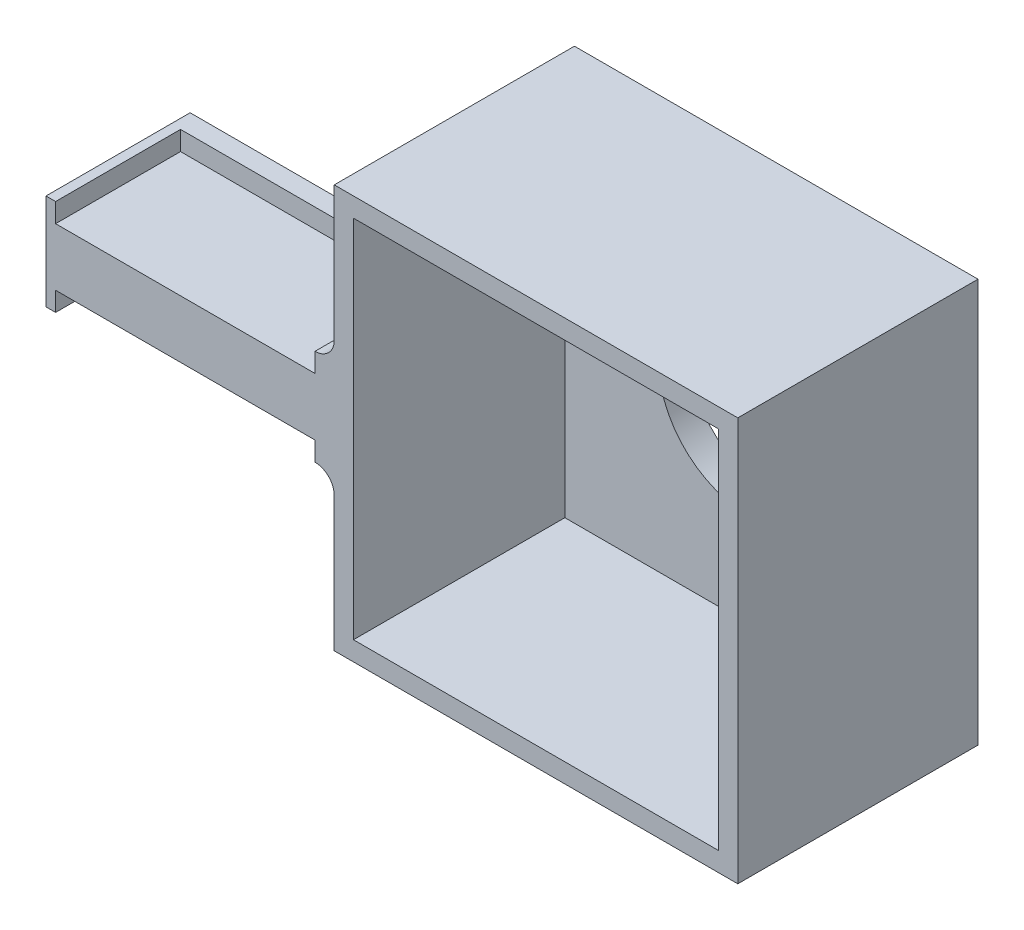
ISO-10303-21;
HEADER;
FILE_DESCRIPTION(('STEP AP214'),'2;1');
FILE_NAME('part.step','',(''),(''),'','','');
FILE_SCHEMA(('AUTOMOTIVE_DESIGN { 1 0 10303 214 1 1 1 1 }'));
ENDSEC;
DATA;
#1=APPLICATION_CONTEXT('core data for automotive mechanical design processes');
#2=APPLICATION_PROTOCOL_DEFINITION('international standard','automotive_design',2000,#1);
#3=PRODUCT_CONTEXT('',#1,'mechanical');
#4=PRODUCT('Part','Part','',(#3));
#5=PRODUCT_RELATED_PRODUCT_CATEGORY('part','',(#4));
#6=PRODUCT_DEFINITION_FORMATION('','',#4);
#7=PRODUCT_DEFINITION_CONTEXT('part definition',#1,'design');
#8=PRODUCT_DEFINITION('design','',#6,#7);
#9=PRODUCT_DEFINITION_SHAPE('','',#8);
#10=(LENGTH_UNIT() NAMED_UNIT(*) SI_UNIT(.MILLI.,.METRE.));
#11=(NAMED_UNIT(*) PLANE_ANGLE_UNIT() SI_UNIT($,.RADIAN.));
#12=(NAMED_UNIT(*) SI_UNIT($,.STERADIAN.) SOLID_ANGLE_UNIT());
#13=UNCERTAINTY_MEASURE_WITH_UNIT(LENGTH_MEASURE(1.E-05),#10,'distance_accuracy_value','');
#14=(GEOMETRIC_REPRESENTATION_CONTEXT(3) GLOBAL_UNCERTAINTY_ASSIGNED_CONTEXT((#13)) GLOBAL_UNIT_ASSIGNED_CONTEXT((#10,
#11,#12)) REPRESENTATION_CONTEXT('',''));
#15=CARTESIAN_POINT('',(0.,0.,0.));
#16=DIRECTION('',(0.,0.,1.));
#17=DIRECTION('',(1.,0.,0.));
#18=AXIS2_PLACEMENT_3D('',#15,#16,#17);
#19=CARTESIAN_POINT('',(0.,0.,25.));
#20=DIRECTION('',(1.,0.,0.));
#21=DIRECTION('',(0.,1.,0.));
#22=AXIS2_PLACEMENT_3D('',#19,#20,#21);
#23=PLANE('',#22);
#24=DIRECTION('',(0.,-1.,0.));
#25=VECTOR('',#24,1.);
#26=CARTESIAN_POINT('',(0.,0.,25.));
#27=LINE('',#26,#25);
#28=CARTESIAN_POINT('',(0.,-28.,25.));
#29=VERTEX_POINT('',#28);
#30=CARTESIAN_POINT('',(0.,-42.,25.));
#31=VERTEX_POINT('',#30);
#32=EDGE_CURVE('E310',#29,#31,#27,.T.);
#33=ORIENTED_EDGE('',*,*,#32,.F.);
#34=DIRECTION('',(0.,0.,1.));
#35=VECTOR('',#34,1.);
#36=CARTESIAN_POINT('',(0.,-28.,10.));
#37=LINE('',#36,#35);
#38=CARTESIAN_POINT('',(0.,-28.,10.));
#39=VERTEX_POINT('',#38);
#40=EDGE_CURVE('E343',#29,#39,#37,.F.);
#41=ORIENTED_EDGE('',*,*,#40,.T.);
#42=DIRECTION('',(0.,-1.,0.));
#43=VECTOR('',#42,1.);
#44=CARTESIAN_POINT('',(0.,-26.,10.));
#45=LINE('',#44,#43);
#46=CARTESIAN_POINT('',(0.,-14.,10.));
#47=VERTEX_POINT('',#46);
#48=EDGE_CURVE('E56',#47,#39,#45,.T.);
#49=ORIENTED_EDGE('',*,*,#48,.F.);
#50=DIRECTION('',(0.,0.,-1.));
#51=VECTOR('',#50,1.);
#52=CARTESIAN_POINT('',(0.,-14.,25.));
#53=LINE('',#52,#51);
#54=CARTESIAN_POINT('',(0.,-14.,25.));
#55=VERTEX_POINT('',#54);
#56=EDGE_CURVE('E341',#47,#55,#53,.F.);
#57=ORIENTED_EDGE('',*,*,#56,.T.);
#58=CARTESIAN_POINT('',(0.,0.,25.));
#59=VERTEX_POINT('',#58);
#60=EDGE_CURVE('E306',#59,#55,#27,.T.);
#61=ORIENTED_EDGE('',*,*,#60,.F.);
#62=DIRECTION('',(0.,0.,-1.));
#63=VECTOR('',#62,1.);
#64=CARTESIAN_POINT('',(0.,0.,25.));
#65=LINE('',#64,#63);
#66=CARTESIAN_POINT('',(0.,0.,0.));
#67=VERTEX_POINT('',#66);
#68=EDGE_CURVE('E316',#59,#67,#65,.T.);
#69=ORIENTED_EDGE('',*,*,#68,.T.);
#70=DIRECTION('',(0.,-1.,0.));
#71=VECTOR('',#70,1.);
#72=CARTESIAN_POINT('',(0.,0.,0.));
#73=LINE('',#72,#71);
#74=CARTESIAN_POINT('',(0.,-42.,0.));
#75=VERTEX_POINT('',#74);
#76=EDGE_CURVE('E299',#67,#75,#73,.T.);
#77=ORIENTED_EDGE('',*,*,#76,.T.);
#78=DIRECTION('',(0.,0.,-1.));
#79=VECTOR('',#78,1.);
#80=CARTESIAN_POINT('',(0.,-42.,25.));
#81=LINE('',#80,#79);
#82=EDGE_CURVE('E333',#31,#75,#81,.T.);
#83=ORIENTED_EDGE('',*,*,#82,.F.);
#84=EDGE_LOOP('',(#33,#41,#49,#57,#61,#69,#77,#83));
#85=FACE_BOUND('',#84,.T.);
#86=ADVANCED_FACE('F33',(#85),#23,.F.);
#87=CARTESIAN_POINT('',(0.,-42.,25.));
#88=DIRECTION('',(0.,1.,0.));
#89=DIRECTION('',(0.,0.,1.));
#90=AXIS2_PLACEMENT_3D('',#87,#88,#89);
#91=PLANE('',#90);
#92=DIRECTION('',(1.,0.,0.));
#93=VECTOR('',#92,1.);
#94=CARTESIAN_POINT('',(0.,-42.,0.));
#95=LINE('',#94,#93);
#96=CARTESIAN_POINT('',(42.,-42.,0.));
#97=VERTEX_POINT('',#96);
#98=EDGE_CURVE('E319',#75,#97,#95,.T.);
#99=ORIENTED_EDGE('',*,*,#98,.T.);
#100=DIRECTION('',(0.,0.,-1.));
#101=VECTOR('',#100,1.);
#102=CARTESIAN_POINT('',(42.,-42.,25.));
#103=LINE('',#102,#101);
#104=CARTESIAN_POINT('',(42.,-42.,25.));
#105=VERTEX_POINT('',#104);
#106=EDGE_CURVE('E330',#105,#97,#103,.T.);
#107=ORIENTED_EDGE('',*,*,#106,.F.);
#108=DIRECTION('',(1.,0.,0.));
#109=VECTOR('',#108,1.);
#110=CARTESIAN_POINT('',(0.,-42.,25.));
#111=LINE('',#110,#109);
#112=EDGE_CURVE('E309',#31,#105,#111,.T.);
#113=ORIENTED_EDGE('',*,*,#112,.F.);
#114=ORIENTED_EDGE('',*,*,#82,.T.);
#115=EDGE_LOOP('',(#99,#107,#113,#114));
#116=FACE_BOUND('',#115,.T.);
#117=ADVANCED_FACE('F374',(#116),#91,.F.);
#118=CARTESIAN_POINT('',(42.,0.,25.));
#119=DIRECTION('',(-1.,0.,0.));
#120=DIRECTION('',(0.,-1.,0.));
#121=AXIS2_PLACEMENT_3D('',#118,#119,#120);
#122=PLANE('',#121);
#123=DIRECTION('',(0.,1.,0.));
#124=VECTOR('',#123,1.);
#125=CARTESIAN_POINT('',(42.,0.,0.));
#126=LINE('',#125,#124);
#127=CARTESIAN_POINT('',(42.,0.,0.));
#128=VERTEX_POINT('',#127);
#129=EDGE_CURVE('E321',#97,#128,#126,.T.);
#130=ORIENTED_EDGE('',*,*,#129,.T.);
#131=DIRECTION('',(0.,0.,-1.));
#132=VECTOR('',#131,1.);
#133=CARTESIAN_POINT('',(42.,0.,25.));
#134=LINE('',#133,#132);
#135=CARTESIAN_POINT('',(42.,0.,25.));
#136=VERTEX_POINT('',#135);
#137=EDGE_CURVE('E327',#136,#128,#134,.T.);
#138=ORIENTED_EDGE('',*,*,#137,.F.);
#139=DIRECTION('',(0.,1.,0.));
#140=VECTOR('',#139,1.);
#141=CARTESIAN_POINT('',(42.,0.,25.));
#142=LINE('',#141,#140);
#143=EDGE_CURVE('E312',#105,#136,#142,.T.);
#144=ORIENTED_EDGE('',*,*,#143,.F.);
#145=ORIENTED_EDGE('',*,*,#106,.T.);
#146=EDGE_LOOP('',(#130,#138,#144,#145));
#147=FACE_BOUND('',#146,.T.);
#148=ADVANCED_FACE('F406',(#147),#122,.F.);
#149=CARTESIAN_POINT('',(0.,0.,25.));
#150=DIRECTION('',(0.,-1.,0.));
#151=DIRECTION('',(0.,0.,-1.));
#152=AXIS2_PLACEMENT_3D('',#149,#150,#151);
#153=PLANE('',#152);
#154=DIRECTION('',(-1.,0.,0.));
#155=VECTOR('',#154,1.);
#156=CARTESIAN_POINT('',(0.,0.,0.));
#157=LINE('',#156,#155);
#158=EDGE_CURVE('E323',#128,#67,#157,.T.);
#159=ORIENTED_EDGE('',*,*,#158,.T.);
#160=ORIENTED_EDGE('',*,*,#68,.F.);
#161=DIRECTION('',(-1.,0.,0.));
#162=VECTOR('',#161,1.);
#163=CARTESIAN_POINT('',(0.,0.,25.));
#164=LINE('',#163,#162);
#165=EDGE_CURVE('E314',#136,#59,#164,.T.);
#166=ORIENTED_EDGE('',*,*,#165,.F.);
#167=ORIENTED_EDGE('',*,*,#137,.T.);
#168=EDGE_LOOP('',(#159,#160,#166,#167));
#169=FACE_BOUND('',#168,.T.);
#170=ADVANCED_FACE('F364',(#169),#153,.F.);
#171=CARTESIAN_POINT('',(0.,0.,25.));
#172=DIRECTION('',(0.,0.,1.));
#173=DIRECTION('',(1.,0.,0.));
#174=AXIS2_PLACEMENT_3D('',#171,#172,#173);
#175=PLANE('',#174);
#176=DIRECTION('',(0.,1.,0.));
#177=VECTOR('',#176,1.);
#178=CARTESIAN_POINT('',(-29.,-18.,25.));
#179=LINE('',#178,#177);
#180=CARTESIAN_POINT('',(-29.,-18.,25.));
#181=VERTEX_POINT('',#180);
#182=CARTESIAN_POINT('',(-29.,-16.,25.));
#183=VERTEX_POINT('',#182);
#184=EDGE_CURVE('E176',#181,#183,#179,.T.);
#185=ORIENTED_EDGE('',*,*,#184,.T.);
#186=DIRECTION('',(1.,0.,0.));
#187=VECTOR('',#186,1.);
#188=CARTESIAN_POINT('',(-30.,-16.,25.));
#189=LINE('',#188,#187);
#190=CARTESIAN_POINT('',(-30.,-16.,25.));
#191=VERTEX_POINT('',#190);
#192=EDGE_CURVE('E261',#191,#183,#189,.T.);
#193=ORIENTED_EDGE('',*,*,#192,.F.);
#194=DIRECTION('',(0.,1.,0.));
#195=VECTOR('',#194,1.);
#196=CARTESIAN_POINT('',(-30.,-26.,25.));
#197=LINE('',#196,#195);
#198=CARTESIAN_POINT('',(-30.,-26.,25.));
#199=VERTEX_POINT('',#198);
#200=EDGE_CURVE('E254',#199,#191,#197,.T.);
#201=ORIENTED_EDGE('',*,*,#200,.F.);
#202=DIRECTION('',(1.,0.,0.));
#203=VECTOR('',#202,1.);
#204=CARTESIAN_POINT('',(-30.,-26.,25.));
#205=LINE('',#204,#203);
#206=CARTESIAN_POINT('',(-29.,-26.,25.));
#207=VERTEX_POINT('',#206);
#208=EDGE_CURVE('E263',#199,#207,#205,.T.);
#209=ORIENTED_EDGE('',*,*,#208,.T.);
#210=DIRECTION('',(0.,-1.,0.));
#211=VECTOR('',#210,1.);
#212=CARTESIAN_POINT('',(-29.,-24.,25.));
#213=LINE('',#212,#211);
#214=CARTESIAN_POINT('',(-29.,-24.,25.));
#215=VERTEX_POINT('',#214);
#216=EDGE_CURVE('E245',#215,#207,#213,.T.);
#217=ORIENTED_EDGE('',*,*,#216,.F.);
#218=DIRECTION('',(-1.,0.,0.));
#219=VECTOR('',#218,1.);
#220=CARTESIAN_POINT('',(-2.,-24.,25.));
#221=LINE('',#220,#219);
#222=CARTESIAN_POINT('',(-2.,-24.,25.));
#223=VERTEX_POINT('',#222);
#224=EDGE_CURVE('E223',#223,#215,#221,.T.);
#225=ORIENTED_EDGE('',*,*,#224,.F.);
#226=DIRECTION('',(0.,-1.,0.));
#227=VECTOR('',#226,1.);
#228=CARTESIAN_POINT('',(-2.,-24.,25.));
#229=LINE('',#228,#227);
#230=CARTESIAN_POINT('',(-2.,-26.,25.));
#231=VERTEX_POINT('',#230);
#232=EDGE_CURVE('E233',#223,#231,#229,.T.);
#233=ORIENTED_EDGE('',*,*,#232,.T.);
#234=CARTESIAN_POINT('',(-1.99999999999999,-28.,25.));
#235=DIRECTION('',(0.,0.,1.));
#236=DIRECTION('',(1.,0.,0.));
#237=AXIS2_PLACEMENT_3D('',#234,#235,#236);
#238=CIRCLE('',#237,2.);
#239=EDGE_CURVE('E346',#231,#29,#238,.F.);
#240=ORIENTED_EDGE('',*,*,#239,.T.);
#241=ORIENTED_EDGE('',*,*,#32,.T.);
#242=ORIENTED_EDGE('',*,*,#112,.T.);
#243=ORIENTED_EDGE('',*,*,#143,.T.);
#244=ORIENTED_EDGE('',*,*,#165,.T.);
#245=ORIENTED_EDGE('',*,*,#60,.T.);
#246=CARTESIAN_POINT('',(-1.99999999999999,-14.,25.));
#247=DIRECTION('',(0.,0.,1.));
#248=DIRECTION('',(1.,0.,0.));
#249=AXIS2_PLACEMENT_3D('',#246,#247,#248);
#250=CIRCLE('',#249,2.);
#251=CARTESIAN_POINT('',(-2.,-16.,25.));
#252=VERTEX_POINT('',#251);
#253=EDGE_CURVE('E11',#55,#252,#250,.F.);
#254=ORIENTED_EDGE('',*,*,#253,.T.);
#255=DIRECTION('',(0.,1.,0.));
#256=VECTOR('',#255,1.);
#257=CARTESIAN_POINT('',(-2.,-18.,25.));
#258=LINE('',#257,#256);
#259=CARTESIAN_POINT('',(-2.,-18.,25.));
#260=VERTEX_POINT('',#259);
#261=EDGE_CURVE('E187',#260,#252,#258,.T.);
#262=ORIENTED_EDGE('',*,*,#261,.F.);
#263=DIRECTION('',(1.,0.,0.));
#264=VECTOR('',#263,1.);
#265=CARTESIAN_POINT('',(-29.,-18.,25.));
#266=LINE('',#265,#264);
#267=EDGE_CURVE('E194',#181,#260,#266,.T.);
#268=ORIENTED_EDGE('',*,*,#267,.F.);
#269=EDGE_LOOP('',(#185,#193,#201,#209,#217,#225,#233,#240,#241,#242,#243,#244,#245,#254,#262,#268));
#270=FACE_BOUND('',#269,.T.);
#271=DIRECTION('',(0.,-1.,0.));
#272=VECTOR('',#271,1.);
#273=CARTESIAN_POINT('',(2.,-2.,25.));
#274=LINE('',#273,#272);
#275=CARTESIAN_POINT('',(2.,-2.,25.));
#276=VERTEX_POINT('',#275);
#277=CARTESIAN_POINT('',(2.,-40.,25.));
#278=VERTEX_POINT('',#277);
#279=EDGE_CURVE('E287',#276,#278,#274,.T.);
#280=ORIENTED_EDGE('',*,*,#279,.F.);
#281=DIRECTION('',(-1.,0.,0.));
#282=VECTOR('',#281,1.);
#283=CARTESIAN_POINT('',(2.,-2.,25.));
#284=LINE('',#283,#282);
#285=CARTESIAN_POINT('',(40.,-2.,25.));
#286=VERTEX_POINT('',#285);
#287=EDGE_CURVE('E277',#286,#276,#284,.T.);
#288=ORIENTED_EDGE('',*,*,#287,.F.);
#289=DIRECTION('',(0.,1.,0.));
#290=VECTOR('',#289,1.);
#291=CARTESIAN_POINT('',(40.,-2.,25.));
#292=LINE('',#291,#290);
#293=CARTESIAN_POINT('',(40.,-40.,25.));
#294=VERTEX_POINT('',#293);
#295=EDGE_CURVE('E292',#294,#286,#292,.T.);
#296=ORIENTED_EDGE('',*,*,#295,.F.);
#297=DIRECTION('',(1.,0.,0.));
#298=VECTOR('',#297,1.);
#299=CARTESIAN_POINT('',(2.,-40.,25.));
#300=LINE('',#299,#298);
#301=EDGE_CURVE('E289',#278,#294,#300,.T.);
#302=ORIENTED_EDGE('',*,*,#301,.F.);
#303=EDGE_LOOP('',(#280,#288,#296,#302));
#304=FACE_BOUND('',#303,.T.);
#305=ADVANCED_FACE('F199',(#270,#304),#175,.T.);
#306=CARTESIAN_POINT('',(0.,0.,0.));
#307=DIRECTION('',(0.,0.,1.));
#308=DIRECTION('',(1.,0.,0.));
#309=AXIS2_PLACEMENT_3D('',#306,#307,#308);
#310=PLANE('',#309);
#311=CARTESIAN_POINT('',(21.,-21.,0.));
#312=DIRECTION('',(0.,0.,-1.));
#313=DIRECTION('',(-1.,0.,0.));
#314=AXIS2_PLACEMENT_3D('',#311,#312,#313);
#315=CIRCLE('',#314,9.25);
#316=CARTESIAN_POINT('',(11.75,-21.,0.));
#317=VERTEX_POINT('',#316);
#318=EDGE_CURVE('E269',#317,#317,#315,.T.);
#319=ORIENTED_EDGE('',*,*,#318,.F.);
#320=EDGE_LOOP('',(#319));
#321=FACE_BOUND('',#320,.T.);
#322=ORIENTED_EDGE('',*,*,#76,.F.);
#323=ORIENTED_EDGE('',*,*,#158,.F.);
#324=ORIENTED_EDGE('',*,*,#129,.F.);
#325=ORIENTED_EDGE('',*,*,#98,.F.);
#326=EDGE_LOOP('',(#322,#323,#324,#325));
#327=FACE_BOUND('',#326,.T.);
#328=ADVANCED_FACE('F369',(#321,#327),#310,.F.);
#329=CARTESIAN_POINT('',(2.,-2.,3.));
#330=DIRECTION('',(-1.,0.,0.));
#331=DIRECTION('',(0.,-1.,0.));
#332=AXIS2_PLACEMENT_3D('',#329,#330,#331);
#333=PLANE('',#332);
#334=ORIENTED_EDGE('',*,*,#279,.T.);
#335=DIRECTION('',(0.,0.,1.));
#336=VECTOR('',#335,1.);
#337=CARTESIAN_POINT('',(2.,-40.,3.));
#338=LINE('',#337,#336);
#339=CARTESIAN_POINT('',(2.,-40.,3.));
#340=VERTEX_POINT('',#339);
#341=EDGE_CURVE('E286',#340,#278,#338,.T.);
#342=ORIENTED_EDGE('',*,*,#341,.F.);
#343=DIRECTION('',(0.,-1.,0.));
#344=VECTOR('',#343,1.);
#345=CARTESIAN_POINT('',(2.,-2.,3.));
#346=LINE('',#345,#344);
#347=CARTESIAN_POINT('',(2.,-2.,3.));
#348=VERTEX_POINT('',#347);
#349=EDGE_CURVE('E273',#348,#340,#346,.T.);
#350=ORIENTED_EDGE('',*,*,#349,.F.);
#351=DIRECTION('',(0.,0.,1.));
#352=VECTOR('',#351,1.);
#353=CARTESIAN_POINT('',(2.,-2.,3.));
#354=LINE('',#353,#352);
#355=EDGE_CURVE('E297',#348,#276,#354,.T.);
#356=ORIENTED_EDGE('',*,*,#355,.T.);
#357=EDGE_LOOP('',(#334,#342,#350,#356));
#358=FACE_BOUND('',#357,.T.);
#359=ADVANCED_FACE('F568',(#358),#333,.F.);
#360=CARTESIAN_POINT('',(2.,-2.,3.));
#361=DIRECTION('',(0.,1.,0.));
#362=DIRECTION('',(0.,0.,1.));
#363=AXIS2_PLACEMENT_3D('',#360,#361,#362);
#364=PLANE('',#363);
#365=ORIENTED_EDGE('',*,*,#287,.T.);
#366=ORIENTED_EDGE('',*,*,#355,.F.);
#367=DIRECTION('',(-1.,0.,0.));
#368=VECTOR('',#367,1.);
#369=CARTESIAN_POINT('',(2.,-2.,3.));
#370=LINE('',#369,#368);
#371=CARTESIAN_POINT('',(40.,-2.,3.));
#372=VERTEX_POINT('',#371);
#373=EDGE_CURVE('E283',#372,#348,#370,.T.);
#374=ORIENTED_EDGE('',*,*,#373,.F.);
#375=DIRECTION('',(0.,0.,1.));
#376=VECTOR('',#375,1.);
#377=CARTESIAN_POINT('',(40.,-2.,3.));
#378=LINE('',#377,#376);
#379=EDGE_CURVE('E300',#372,#286,#378,.T.);
#380=ORIENTED_EDGE('',*,*,#379,.T.);
#381=EDGE_LOOP('',(#365,#366,#374,#380));
#382=FACE_BOUND('',#381,.T.);
#383=ADVANCED_FACE('F588',(#382),#364,.F.);
#384=CARTESIAN_POINT('',(40.,-2.,3.));
#385=DIRECTION('',(1.,0.,0.));
#386=DIRECTION('',(0.,0.,-1.));
#387=AXIS2_PLACEMENT_3D('',#384,#385,#386);
#388=PLANE('',#387);
#389=ORIENTED_EDGE('',*,*,#295,.T.);
#390=ORIENTED_EDGE('',*,*,#379,.F.);
#391=DIRECTION('',(0.,1.,0.));
#392=VECTOR('',#391,1.);
#393=CARTESIAN_POINT('',(40.,-2.,3.));
#394=LINE('',#393,#392);
#395=CARTESIAN_POINT('',(40.,-40.,3.));
#396=VERTEX_POINT('',#395);
#397=EDGE_CURVE('E280',#396,#372,#394,.T.);
#398=ORIENTED_EDGE('',*,*,#397,.F.);
#399=DIRECTION('',(0.,0.,1.));
#400=VECTOR('',#399,1.);
#401=CARTESIAN_POINT('',(40.,-40.,3.));
#402=LINE('',#401,#400);
#403=EDGE_CURVE('E302',#396,#294,#402,.T.);
#404=ORIENTED_EDGE('',*,*,#403,.T.);
#405=EDGE_LOOP('',(#389,#390,#398,#404));
#406=FACE_BOUND('',#405,.T.);
#407=ADVANCED_FACE('F578',(#406),#388,.F.);
#408=CARTESIAN_POINT('',(2.,-40.,3.));
#409=DIRECTION('',(0.,-1.,0.));
#410=DIRECTION('',(0.,0.,-1.));
#411=AXIS2_PLACEMENT_3D('',#408,#409,#410);
#412=PLANE('',#411);
#413=ORIENTED_EDGE('',*,*,#301,.T.);
#414=ORIENTED_EDGE('',*,*,#403,.F.);
#415=DIRECTION('',(1.,0.,0.));
#416=VECTOR('',#415,1.);
#417=CARTESIAN_POINT('',(2.,-40.,3.));
#418=LINE('',#417,#416);
#419=EDGE_CURVE('E276',#340,#396,#418,.T.);
#420=ORIENTED_EDGE('',*,*,#419,.F.);
#421=ORIENTED_EDGE('',*,*,#341,.T.);
#422=EDGE_LOOP('',(#413,#414,#420,#421));
#423=FACE_BOUND('',#422,.T.);
#424=ADVANCED_FACE('F557',(#423),#412,.F.);
#425=CARTESIAN_POINT('',(0.,0.,3.));
#426=DIRECTION('',(0.,0.,1.));
#427=DIRECTION('',(1.,0.,0.));
#428=AXIS2_PLACEMENT_3D('',#425,#426,#427);
#429=PLANE('',#428);
#430=CARTESIAN_POINT('',(21.,-21.,3.));
#431=DIRECTION('',(0.,0.,1.));
#432=DIRECTION('',(1.,0.,0.));
#433=AXIS2_PLACEMENT_3D('',#430,#431,#432);
#434=CIRCLE('',#433,9.25);
#435=CARTESIAN_POINT('',(30.25,-21.,3.));
#436=VERTEX_POINT('',#435);
#437=EDGE_CURVE('E272',#436,#436,#434,.T.);
#438=ORIENTED_EDGE('',*,*,#437,.F.);
#439=EDGE_LOOP('',(#438));
#440=FACE_BOUND('',#439,.T.);
#441=ORIENTED_EDGE('',*,*,#349,.T.);
#442=ORIENTED_EDGE('',*,*,#419,.T.);
#443=ORIENTED_EDGE('',*,*,#397,.T.);
#444=ORIENTED_EDGE('',*,*,#373,.T.);
#445=EDGE_LOOP('',(#441,#442,#443,#444));
#446=FACE_BOUND('',#445,.T.);
#447=ADVANCED_FACE('F547',(#440,#446),#429,.T.);
#448=CARTESIAN_POINT('',(21.,-21.,25.));
#449=DIRECTION('',(0.,0.,-1.));
#450=DIRECTION('',(-1.,0.,0.));
#451=AXIS2_PLACEMENT_3D('',#448,#449,#450);
#452=CYLINDRICAL_SURFACE('',#451,9.25);
#453=ORIENTED_EDGE('',*,*,#437,.T.);
#454=EDGE_LOOP('',(#453));
#455=FACE_BOUND('',#454,.T.);
#456=ORIENTED_EDGE('',*,*,#318,.T.);
#457=EDGE_LOOP('',(#456));
#458=FACE_BOUND('',#457,.T.);
#459=ADVANCED_FACE('F513',(#455,#458),#452,.F.);
#460=CARTESIAN_POINT('',(-30.,-26.,10.));
#461=DIRECTION('',(0.,0.,1.));
#462=DIRECTION('',(1.,0.,0.));
#463=AXIS2_PLACEMENT_3D('',#460,#461,#462);
#464=PLANE('',#463);
#465=ORIENTED_EDGE('',*,*,#48,.T.);
#466=CARTESIAN_POINT('',(-1.99999999999999,-28.,10.));
#467=DIRECTION('',(0.,0.,1.));
#468=DIRECTION('',(1.,0.,0.));
#469=AXIS2_PLACEMENT_3D('',#466,#467,#468);
#470=CIRCLE('',#469,2.);
#471=CARTESIAN_POINT('',(-1.99999999999999,-26.,10.));
#472=VERTEX_POINT('',#471);
#473=EDGE_CURVE('E348',#39,#472,#470,.T.);
#474=ORIENTED_EDGE('',*,*,#473,.T.);
#475=DIRECTION('',(1.,0.,0.));
#476=VECTOR('',#475,1.);
#477=CARTESIAN_POINT('',(-30.,-26.,10.));
#478=LINE('',#477,#476);
#479=CARTESIAN_POINT('',(-30.,-26.,10.));
#480=VERTEX_POINT('',#479);
#481=EDGE_CURVE('E266',#480,#472,#478,.T.);
#482=ORIENTED_EDGE('',*,*,#481,.F.);
#483=DIRECTION('',(0.,-1.,0.));
#484=VECTOR('',#483,1.);
#485=CARTESIAN_POINT('',(-30.,-26.,10.));
#486=LINE('',#485,#484);
#487=CARTESIAN_POINT('',(-30.,-16.,10.));
#488=VERTEX_POINT('',#487);
#489=EDGE_CURVE('E249',#488,#480,#486,.T.);
#490=ORIENTED_EDGE('',*,*,#489,.F.);
#491=DIRECTION('',(1.,0.,0.));
#492=VECTOR('',#491,1.);
#493=CARTESIAN_POINT('',(-30.,-16.,10.));
#494=LINE('',#493,#492);
#495=CARTESIAN_POINT('',(-1.99999999999999,-16.,10.));
#496=VERTEX_POINT('',#495);
#497=EDGE_CURVE('E258',#488,#496,#494,.T.);
#498=ORIENTED_EDGE('',*,*,#497,.T.);
#499=CARTESIAN_POINT('',(-1.99999999999999,-14.,10.));
#500=DIRECTION('',(0.,0.,1.));
#501=DIRECTION('',(1.,0.,0.));
#502=AXIS2_PLACEMENT_3D('',#499,#500,#501);
#503=CIRCLE('',#502,2.);
#504=EDGE_CURVE('E41',#496,#47,#503,.T.);
#505=ORIENTED_EDGE('',*,*,#504,.T.);
#506=EDGE_LOOP('',(#465,#474,#482,#490,#498,#505));
#507=FACE_BOUND('',#506,.T.);
#508=ADVANCED_FACE('F351',(#507),#464,.F.);
#509=CARTESIAN_POINT('',(-30.,-26.,10.));
#510=DIRECTION('',(0.,1.,0.));
#511=DIRECTION('',(-1.,0.,0.));
#512=AXIS2_PLACEMENT_3D('',#509,#510,#511);
#513=PLANE('',#512);
#514=ORIENTED_EDGE('',*,*,#481,.T.);
#515=DIRECTION('',(0.,0.,1.));
#516=VECTOR('',#515,1.);
#517=CARTESIAN_POINT('',(-2.,-26.,25.));
#518=LINE('',#517,#516);
#519=CARTESIAN_POINT('',(-2.,-26.,13.));
#520=VERTEX_POINT('',#519);
#521=EDGE_CURVE('E336',#472,#520,#518,.T.);
#522=ORIENTED_EDGE('',*,*,#521,.T.);
#523=DIRECTION('',(1.,0.,0.));
#524=VECTOR('',#523,1.);
#525=CARTESIAN_POINT('',(-2.,-26.,13.));
#526=LINE('',#525,#524);
#527=CARTESIAN_POINT('',(-29.,-26.,13.));
#528=VERTEX_POINT('',#527);
#529=EDGE_CURVE('E224',#528,#520,#526,.T.);
#530=ORIENTED_EDGE('',*,*,#529,.F.);
#531=DIRECTION('',(0.,0.,-1.));
#532=VECTOR('',#531,1.);
#533=CARTESIAN_POINT('',(-29.,-26.,13.));
#534=LINE('',#533,#532);
#535=EDGE_CURVE('E235',#207,#528,#534,.T.);
#536=ORIENTED_EDGE('',*,*,#535,.F.);
#537=ORIENTED_EDGE('',*,*,#208,.F.);
#538=DIRECTION('',(0.,0.,1.));
#539=VECTOR('',#538,1.);
#540=CARTESIAN_POINT('',(-30.,-26.,10.));
#541=LINE('',#540,#539);
#542=EDGE_CURVE('E252',#480,#199,#541,.T.);
#543=ORIENTED_EDGE('',*,*,#542,.F.);
#544=EDGE_LOOP('',(#514,#522,#530,#536,#537,#543));
#545=FACE_BOUND('',#544,.T.);
#546=ADVANCED_FACE('F383',(#545),#513,.F.);
#547=CARTESIAN_POINT('',(-30.,-16.,10.));
#548=DIRECTION('',(0.,-1.,0.));
#549=DIRECTION('',(1.,0.,0.));
#550=AXIS2_PLACEMENT_3D('',#547,#548,#549);
#551=PLANE('',#550);
#552=DIRECTION('',(-1.,0.,0.));
#553=VECTOR('',#552,1.);
#554=CARTESIAN_POINT('',(-29.,-16.,12.));
#555=LINE('',#554,#553);
#556=CARTESIAN_POINT('',(-2.,-16.,12.));
#557=VERTEX_POINT('',#556);
#558=CARTESIAN_POINT('',(-29.,-16.,12.));
#559=VERTEX_POINT('',#558);
#560=EDGE_CURVE('E197',#557,#559,#555,.T.);
#561=ORIENTED_EDGE('',*,*,#560,.F.);
#562=DIRECTION('',(0.,0.,-1.));
#563=VECTOR('',#562,1.);
#564=CARTESIAN_POINT('',(-1.99999999999999,-16.,10.));
#565=LINE('',#564,#563);
#566=EDGE_CURVE('E48',#557,#496,#565,.T.);
#567=ORIENTED_EDGE('',*,*,#566,.T.);
#568=ORIENTED_EDGE('',*,*,#497,.F.);
#569=DIRECTION('',(0.,0.,-1.));
#570=VECTOR('',#569,1.);
#571=CARTESIAN_POINT('',(-30.,-16.,10.));
#572=LINE('',#571,#570);
#573=EDGE_CURVE('E256',#191,#488,#572,.T.);
#574=ORIENTED_EDGE('',*,*,#573,.F.);
#575=ORIENTED_EDGE('',*,*,#192,.T.);
#576=DIRECTION('',(0.,0.,1.));
#577=VECTOR('',#576,1.);
#578=CARTESIAN_POINT('',(-29.,-16.,12.));
#579=LINE('',#578,#577);
#580=EDGE_CURVE('E182',#559,#183,#579,.T.);
#581=ORIENTED_EDGE('',*,*,#580,.F.);
#582=EDGE_LOOP('',(#561,#567,#568,#574,#575,#581));
#583=FACE_BOUND('',#582,.T.);
#584=ADVANCED_FACE('F391',(#583),#551,.F.);
#585=CARTESIAN_POINT('',(-30.,0.,0.));
#586=DIRECTION('',(1.,0.,0.));
#587=DIRECTION('',(0.,1.,0.));
#588=AXIS2_PLACEMENT_3D('',#585,#586,#587);
#589=PLANE('',#588);
#590=ORIENTED_EDGE('',*,*,#489,.T.);
#591=ORIENTED_EDGE('',*,*,#542,.T.);
#592=ORIENTED_EDGE('',*,*,#200,.T.);
#593=ORIENTED_EDGE('',*,*,#573,.T.);
#594=EDGE_LOOP('',(#590,#591,#592,#593));
#595=FACE_BOUND('',#594,.T.);
#596=ADVANCED_FACE('F389',(#595),#589,.F.);
#597=CARTESIAN_POINT('',(-2.,-24.,13.));
#598=DIRECTION('',(1.,0.,0.));
#599=DIRECTION('',(0.,1.,0.));
#600=AXIS2_PLACEMENT_3D('',#597,#598,#599);
#601=PLANE('',#600);
#602=DIRECTION('',(0.,0.,1.));
#603=VECTOR('',#602,1.);
#604=CARTESIAN_POINT('',(-2.,-26.,13.));
#605=LINE('',#604,#603);
#606=EDGE_CURVE('E215',#520,#231,#605,.T.);
#607=ORIENTED_EDGE('',*,*,#606,.T.);
#608=ORIENTED_EDGE('',*,*,#232,.F.);
#609=DIRECTION('',(0.,0.,1.));
#610=VECTOR('',#609,1.);
#611=CARTESIAN_POINT('',(-2.,-24.,13.));
#612=LINE('',#611,#610);
#613=CARTESIAN_POINT('',(-2.,-24.,13.));
#614=VERTEX_POINT('',#613);
#615=EDGE_CURVE('E220',#614,#223,#612,.T.);
#616=ORIENTED_EDGE('',*,*,#615,.F.);
#617=DIRECTION('',(0.,-1.,0.));
#618=VECTOR('',#617,1.);
#619=CARTESIAN_POINT('',(-2.,-24.,13.));
#620=LINE('',#619,#618);
#621=EDGE_CURVE('E240',#614,#520,#620,.T.);
#622=ORIENTED_EDGE('',*,*,#621,.T.);
#623=EDGE_LOOP('',(#607,#608,#616,#622));
#624=FACE_BOUND('',#623,.T.);
#625=ADVANCED_FACE('F398',(#624),#601,.F.);
#626=CARTESIAN_POINT('',(-2.,-24.,13.));
#627=DIRECTION('',(0.,0.,-1.));
#628=DIRECTION('',(-1.,0.,0.));
#629=AXIS2_PLACEMENT_3D('',#626,#627,#628);
#630=PLANE('',#629);
#631=ORIENTED_EDGE('',*,*,#529,.T.);
#632=ORIENTED_EDGE('',*,*,#621,.F.);
#633=DIRECTION('',(1.,0.,0.));
#634=VECTOR('',#633,1.);
#635=CARTESIAN_POINT('',(-2.,-24.,13.));
#636=LINE('',#635,#634);
#637=CARTESIAN_POINT('',(-29.,-24.,13.));
#638=VERTEX_POINT('',#637);
#639=EDGE_CURVE('E230',#638,#614,#636,.T.);
#640=ORIENTED_EDGE('',*,*,#639,.F.);
#641=DIRECTION('',(0.,-1.,0.));
#642=VECTOR('',#641,1.);
#643=CARTESIAN_POINT('',(-29.,-24.,13.));
#644=LINE('',#643,#642);
#645=EDGE_CURVE('E243',#638,#528,#644,.T.);
#646=ORIENTED_EDGE('',*,*,#645,.T.);
#647=EDGE_LOOP('',(#631,#632,#640,#646));
#648=FACE_BOUND('',#647,.T.);
#649=ADVANCED_FACE('F433',(#648),#630,.F.);
#650=CARTESIAN_POINT('',(-29.,-24.,13.));
#651=DIRECTION('',(-1.,0.,0.));
#652=DIRECTION('',(0.,-1.,0.));
#653=AXIS2_PLACEMENT_3D('',#650,#651,#652);
#654=PLANE('',#653);
#655=ORIENTED_EDGE('',*,*,#535,.T.);
#656=ORIENTED_EDGE('',*,*,#645,.F.);
#657=DIRECTION('',(0.,0.,-1.));
#658=VECTOR('',#657,1.);
#659=CARTESIAN_POINT('',(-29.,-24.,13.));
#660=LINE('',#659,#658);
#661=EDGE_CURVE('E227',#215,#638,#660,.T.);
#662=ORIENTED_EDGE('',*,*,#661,.F.);
#663=ORIENTED_EDGE('',*,*,#216,.T.);
#664=EDGE_LOOP('',(#655,#656,#662,#663));
#665=FACE_BOUND('',#664,.T.);
#666=ADVANCED_FACE('F431',(#665),#654,.F.);
#667=CARTESIAN_POINT('',(0.,-24.,0.));
#668=DIRECTION('',(0.,-1.,0.));
#669=DIRECTION('',(1.,0.,0.));
#670=AXIS2_PLACEMENT_3D('',#667,#668,#669);
#671=PLANE('',#670);
#672=ORIENTED_EDGE('',*,*,#615,.T.);
#673=ORIENTED_EDGE('',*,*,#224,.T.);
#674=ORIENTED_EDGE('',*,*,#661,.T.);
#675=ORIENTED_EDGE('',*,*,#639,.T.);
#676=EDGE_LOOP('',(#672,#673,#674,#675));
#677=FACE_BOUND('',#676,.T.);
#678=ADVANCED_FACE('F428',(#677),#671,.T.);
#679=CARTESIAN_POINT('',(-29.,-18.,12.));
#680=DIRECTION('',(-1.,0.,0.));
#681=DIRECTION('',(0.,-1.,0.));
#682=AXIS2_PLACEMENT_3D('',#679,#680,#681);
#683=PLANE('',#682);
#684=ORIENTED_EDGE('',*,*,#580,.T.);
#685=ORIENTED_EDGE('',*,*,#184,.F.);
#686=DIRECTION('',(0.,0.,1.));
#687=VECTOR('',#686,1.);
#688=CARTESIAN_POINT('',(-29.,-18.,12.));
#689=LINE('',#688,#687);
#690=CARTESIAN_POINT('',(-29.,-18.,12.));
#691=VERTEX_POINT('',#690);
#692=EDGE_CURVE('E179',#691,#181,#689,.T.);
#693=ORIENTED_EDGE('',*,*,#692,.F.);
#694=DIRECTION('',(0.,1.,0.));
#695=VECTOR('',#694,1.);
#696=CARTESIAN_POINT('',(-29.,-18.,12.));
#697=LINE('',#696,#695);
#698=EDGE_CURVE('E213',#691,#559,#697,.T.);
#699=ORIENTED_EDGE('',*,*,#698,.T.);
#700=EDGE_LOOP('',(#684,#685,#693,#699));
#701=FACE_BOUND('',#700,.T.);
#702=ADVANCED_FACE('F178',(#701),#683,.F.);
#703=CARTESIAN_POINT('',(-29.,-18.,12.));
#704=DIRECTION('',(0.,0.,-1.));
#705=DIRECTION('',(-1.,0.,0.));
#706=AXIS2_PLACEMENT_3D('',#703,#704,#705);
#707=PLANE('',#706);
#708=ORIENTED_EDGE('',*,*,#560,.T.);
#709=ORIENTED_EDGE('',*,*,#698,.F.);
#710=DIRECTION('',(-1.,0.,0.));
#711=VECTOR('',#710,1.);
#712=CARTESIAN_POINT('',(-29.,-18.,12.));
#713=LINE('',#712,#711);
#714=CARTESIAN_POINT('',(-2.,-18.,12.));
#715=VERTEX_POINT('',#714);
#716=EDGE_CURVE('E188',#715,#691,#713,.T.);
#717=ORIENTED_EDGE('',*,*,#716,.F.);
#718=DIRECTION('',(0.,1.,0.));
#719=VECTOR('',#718,1.);
#720=CARTESIAN_POINT('',(-2.,-18.,12.));
#721=LINE('',#720,#719);
#722=EDGE_CURVE('E216',#715,#557,#721,.T.);
#723=ORIENTED_EDGE('',*,*,#722,.T.);
#724=EDGE_LOOP('',(#708,#709,#717,#723));
#725=FACE_BOUND('',#724,.T.);
#726=ADVANCED_FACE('F419',(#725),#707,.F.);
#727=CARTESIAN_POINT('',(-2.,-18.,12.));
#728=DIRECTION('',(1.,0.,0.));
#729=DIRECTION('',(0.,0.,-1.));
#730=AXIS2_PLACEMENT_3D('',#727,#728,#729);
#731=PLANE('',#730);
#732=DIRECTION('',(0.,0.,-1.));
#733=VECTOR('',#732,1.);
#734=CARTESIAN_POINT('',(-2.,-16.,12.));
#735=LINE('',#734,#733);
#736=EDGE_CURVE('E208',#252,#557,#735,.T.);
#737=ORIENTED_EDGE('',*,*,#736,.T.);
#738=ORIENTED_EDGE('',*,*,#722,.F.);
#739=DIRECTION('',(0.,0.,-1.));
#740=VECTOR('',#739,1.);
#741=CARTESIAN_POINT('',(-2.,-18.,12.));
#742=LINE('',#741,#740);
#743=EDGE_CURVE('E202',#260,#715,#742,.T.);
#744=ORIENTED_EDGE('',*,*,#743,.F.);
#745=ORIENTED_EDGE('',*,*,#261,.T.);
#746=EDGE_LOOP('',(#737,#738,#744,#745));
#747=FACE_BOUND('',#746,.T.);
#748=ADVANCED_FACE('F414',(#747),#731,.F.);
#749=CARTESIAN_POINT('',(0.,-18.,0.));
#750=DIRECTION('',(0.,1.,0.));
#751=DIRECTION('',(-1.,0.,0.));
#752=AXIS2_PLACEMENT_3D('',#749,#750,#751);
#753=PLANE('',#752);
#754=ORIENTED_EDGE('',*,*,#692,.T.);
#755=ORIENTED_EDGE('',*,*,#267,.T.);
#756=ORIENTED_EDGE('',*,*,#743,.T.);
#757=ORIENTED_EDGE('',*,*,#716,.T.);
#758=EDGE_LOOP('',(#754,#755,#756,#757));
#759=FACE_BOUND('',#758,.T.);
#760=ADVANCED_FACE('F192',(#759),#753,.T.);
#761=CARTESIAN_POINT('',(-1.99999999999999,-28.,10.));
#762=DIRECTION('',(0.,0.,-1.));
#763=DIRECTION('',(-1.,0.,0.));
#764=AXIS2_PLACEMENT_3D('',#761,#762,#763);
#765=CYLINDRICAL_SURFACE('',#764,2.);
#766=ORIENTED_EDGE('',*,*,#473,.F.);
#767=ORIENTED_EDGE('',*,*,#40,.F.);
#768=ORIENTED_EDGE('',*,*,#239,.F.);
#769=ORIENTED_EDGE('',*,*,#606,.F.);
#770=ORIENTED_EDGE('',*,*,#521,.F.);
#771=EDGE_LOOP('',(#766,#767,#768,#769,#770));
#772=FACE_BOUND('',#771,.T.);
#773=ADVANCED_FACE('F379',(#772),#765,.F.);
#774=CARTESIAN_POINT('',(-1.99999999999999,-14.,10.));
#775=DIRECTION('',(0.,0.,1.));
#776=DIRECTION('',(1.,0.,0.));
#777=AXIS2_PLACEMENT_3D('',#774,#775,#776);
#778=CYLINDRICAL_SURFACE('',#777,2.);
#779=ORIENTED_EDGE('',*,*,#253,.F.);
#780=ORIENTED_EDGE('',*,*,#56,.F.);
#781=ORIENTED_EDGE('',*,*,#504,.F.);
#782=ORIENTED_EDGE('',*,*,#566,.F.);
#783=ORIENTED_EDGE('',*,*,#736,.F.);
#784=EDGE_LOOP('',(#779,#780,#781,#782,#783));
#785=FACE_BOUND('',#784,.T.);
#786=ADVANCED_FACE('F35',(#785),#778,.F.);
#787=CLOSED_SHELL('',(#86,#117,#148,#170,#305,#328,#359,#383,#407,#424,#447,#459,#508,#546,#584,
#596,#625,#649,#666,#678,#702,#726,#748,#760,#773,#786));
#788=MANIFOLD_SOLID_BREP('B2',#787);
#789=ADVANCED_BREP_SHAPE_REPRESENTATION('',(#18,#788),#14);
#790=SHAPE_DEFINITION_REPRESENTATION(#9,#789);
ENDSEC;
END-ISO-10303-21;
